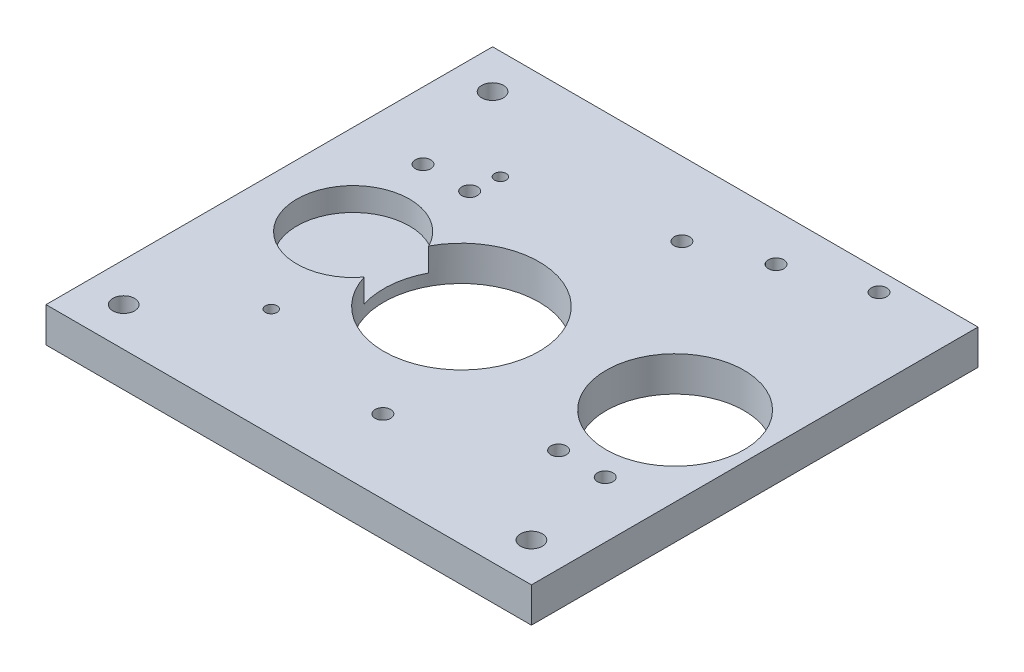
ISO-10303-21;
HEADER;
FILE_DESCRIPTION(('STEP AP214'),'2;1');
FILE_NAME('part.step','',(''),(''),'','','');
FILE_SCHEMA(('AUTOMOTIVE_DESIGN { 1 0 10303 214 1 1 1 1 }'));
ENDSEC;
DATA;
#1=APPLICATION_CONTEXT('core data for automotive mechanical design processes');
#2=APPLICATION_PROTOCOL_DEFINITION('international standard','automotive_design',2000,#1);
#3=PRODUCT_CONTEXT('',#1,'mechanical');
#4=PRODUCT('Part','Part','',(#3));
#5=PRODUCT_RELATED_PRODUCT_CATEGORY('part','',(#4));
#6=PRODUCT_DEFINITION_FORMATION('','',#4);
#7=PRODUCT_DEFINITION_CONTEXT('part definition',#1,'design');
#8=PRODUCT_DEFINITION('design','',#6,#7);
#9=PRODUCT_DEFINITION_SHAPE('','',#8);
#10=(LENGTH_UNIT() NAMED_UNIT(*) SI_UNIT(.MILLI.,.METRE.));
#11=(NAMED_UNIT(*) PLANE_ANGLE_UNIT() SI_UNIT($,.RADIAN.));
#12=(NAMED_UNIT(*) SI_UNIT($,.STERADIAN.) SOLID_ANGLE_UNIT());
#13=UNCERTAINTY_MEASURE_WITH_UNIT(LENGTH_MEASURE(1.E-05),#10,'distance_accuracy_value','');
#14=(GEOMETRIC_REPRESENTATION_CONTEXT(3) GLOBAL_UNCERTAINTY_ASSIGNED_CONTEXT((#13)) GLOBAL_UNIT_ASSIGNED_CONTEXT((#10,
#11,#12)) REPRESENTATION_CONTEXT('',''));
#15=CARTESIAN_POINT('',(0.,0.,0.));
#16=DIRECTION('',(0.,0.,1.));
#17=DIRECTION('',(1.,0.,0.));
#18=AXIS2_PLACEMENT_3D('',#15,#16,#17);
#19=CARTESIAN_POINT('',(17.25,0.,-79.8419145650698));
#20=DIRECTION('',(0.,1.,0.));
#21=DIRECTION('',(0.,0.,1.));
#22=AXIS2_PLACEMENT_3D('',#19,#20,#21);
#23=CYLINDRICAL_SURFACE('',#22,2.00000000000001);
#24=CARTESIAN_POINT('',(17.25,9.,-79.8419145650698));
#25=DIRECTION('',(0.,1.,0.));
#26=DIRECTION('',(0.,0.,1.));
#27=AXIS2_PLACEMENT_3D('',#24,#25,#26);
#28=CIRCLE('',#27,2.00000000000001);
#29=CARTESIAN_POINT('',(17.25,9.,-77.8419145650698));
#30=VERTEX_POINT('',#29);
#31=EDGE_CURVE('E189',#30,#30,#28,.T.);
#32=ORIENTED_EDGE('',*,*,#31,.T.);
#33=EDGE_LOOP('',(#32));
#34=FACE_BOUND('',#33,.T.);
#35=CARTESIAN_POINT('',(17.25,4.,-79.8419145650698));
#36=DIRECTION('',(0.,-1.,0.));
#37=DIRECTION('',(0.,0.,-1.));
#38=AXIS2_PLACEMENT_3D('',#35,#36,#37);
#39=CIRCLE('',#38,2.00000000000001);
#40=CARTESIAN_POINT('',(17.25,4.,-81.8419145650698));
#41=VERTEX_POINT('',#40);
#42=EDGE_CURVE('E40',#41,#41,#39,.F.);
#43=ORIENTED_EDGE('',*,*,#42,.F.);
#44=EDGE_LOOP('',(#43));
#45=FACE_BOUND('',#44,.T.);
#46=ADVANCED_FACE('F36',(#34,#45),#23,.F.);
#47=CARTESIAN_POINT('',(29.25,0.,-79.8419145650698));
#48=DIRECTION('',(0.,1.,0.));
#49=DIRECTION('',(0.,0.,1.));
#50=AXIS2_PLACEMENT_3D('',#47,#48,#49);
#51=CYLINDRICAL_SURFACE('',#50,2.);
#52=CARTESIAN_POINT('',(29.25,9.,-79.8419145650698));
#53=DIRECTION('',(0.,1.,0.));
#54=DIRECTION('',(0.,0.,-1.));
#55=AXIS2_PLACEMENT_3D('',#52,#53,#54);
#56=CIRCLE('',#55,2.);
#57=CARTESIAN_POINT('',(29.25,9.,-81.8419145650698));
#58=VERTEX_POINT('',#57);
#59=EDGE_CURVE('E164',#58,#58,#56,.T.);
#60=ORIENTED_EDGE('',*,*,#59,.T.);
#61=EDGE_LOOP('',(#60));
#62=FACE_BOUND('',#61,.T.);
#63=CARTESIAN_POINT('',(29.25,4.,-79.8419145650698));
#64=DIRECTION('',(0.,-1.,0.));
#65=DIRECTION('',(0.,0.,-1.));
#66=AXIS2_PLACEMENT_3D('',#63,#64,#65);
#67=CIRCLE('',#66,2.);
#68=CARTESIAN_POINT('',(29.25,4.,-81.8419145650698));
#69=VERTEX_POINT('',#68);
#70=EDGE_CURVE('E140',#69,#69,#67,.F.);
#71=ORIENTED_EDGE('',*,*,#70,.F.);
#72=EDGE_LOOP('',(#71));
#73=FACE_BOUND('',#72,.T.);
#74=ADVANCED_FACE('F253',(#62,#73),#51,.F.);
#75=CARTESIAN_POINT('',(0.,9.,0.));
#76=DIRECTION('',(1.,0.,0.));
#77=DIRECTION('',(0.,0.,-1.));
#78=AXIS2_PLACEMENT_3D('',#75,#76,#77);
#79=PLANE('',#78);
#80=DIRECTION('',(0.,0.,1.));
#81=VECTOR('',#80,1.);
#82=CARTESIAN_POINT('',(0.,0.,0.));
#83=LINE('',#82,#81);
#84=CARTESIAN_POINT('',(0.,0.,-115.));
#85=VERTEX_POINT('',#84);
#86=CARTESIAN_POINT('',(0.,0.,0.));
#87=VERTEX_POINT('',#86);
#88=EDGE_CURVE('E117',#85,#87,#83,.T.);
#89=ORIENTED_EDGE('',*,*,#88,.T.);
#90=DIRECTION('',(0.,-1.,0.));
#91=VECTOR('',#90,1.);
#92=CARTESIAN_POINT('',(0.,9.,0.));
#93=LINE('',#92,#91);
#94=CARTESIAN_POINT('',(0.,9.,0.));
#95=VERTEX_POINT('',#94);
#96=EDGE_CURVE('E45',#95,#87,#93,.T.);
#97=ORIENTED_EDGE('',*,*,#96,.F.);
#98=DIRECTION('',(0.,0.,1.));
#99=VECTOR('',#98,1.);
#100=CARTESIAN_POINT('',(0.,9.,0.));
#101=LINE('',#100,#99);
#102=CARTESIAN_POINT('',(0.,9.,-115.));
#103=VERTEX_POINT('',#102);
#104=EDGE_CURVE('E120',#103,#95,#101,.T.);
#105=ORIENTED_EDGE('',*,*,#104,.F.);
#106=DIRECTION('',(0.,-1.,0.));
#107=VECTOR('',#106,1.);
#108=CARTESIAN_POINT('',(0.,9.,-115.));
#109=LINE('',#108,#107);
#110=EDGE_CURVE('E126',#103,#85,#109,.T.);
#111=ORIENTED_EDGE('',*,*,#110,.T.);
#112=EDGE_LOOP('',(#89,#97,#105,#111));
#113=FACE_BOUND('',#112,.T.);
#114=ADVANCED_FACE('F38',(#113),#79,.F.);
#115=CARTESIAN_POINT('',(0.,9.,0.));
#116=DIRECTION('',(0.,0.,-1.));
#117=DIRECTION('',(-1.,0.,0.));
#118=AXIS2_PLACEMENT_3D('',#115,#116,#117);
#119=PLANE('',#118);
#120=DIRECTION('',(1.,0.,0.));
#121=VECTOR('',#120,1.);
#122=CARTESIAN_POINT('',(0.,0.,0.));
#123=LINE('',#122,#121);
#124=CARTESIAN_POINT('',(125.,0.,0.));
#125=VERTEX_POINT('',#124);
#126=EDGE_CURVE('E129',#87,#125,#123,.T.);
#127=ORIENTED_EDGE('',*,*,#126,.T.);
#128=DIRECTION('',(0.,-1.,0.));
#129=VECTOR('',#128,1.);
#130=CARTESIAN_POINT('',(125.,9.,0.));
#131=LINE('',#130,#129);
#132=CARTESIAN_POINT('',(125.,9.,0.));
#133=VERTEX_POINT('',#132);
#134=EDGE_CURVE('E137',#133,#125,#131,.T.);
#135=ORIENTED_EDGE('',*,*,#134,.F.);
#136=DIRECTION('',(1.,0.,0.));
#137=VECTOR('',#136,1.);
#138=CARTESIAN_POINT('',(0.,9.,0.));
#139=LINE('',#138,#137);
#140=EDGE_CURVE('E90',#95,#133,#139,.T.);
#141=ORIENTED_EDGE('',*,*,#140,.F.);
#142=ORIENTED_EDGE('',*,*,#96,.T.);
#143=EDGE_LOOP('',(#127,#135,#141,#142));
#144=FACE_BOUND('',#143,.T.);
#145=ADVANCED_FACE('F313',(#144),#119,.F.);
#146=CARTESIAN_POINT('',(125.,9.,0.));
#147=DIRECTION('',(-1.,0.,0.));
#148=DIRECTION('',(0.,0.,1.));
#149=AXIS2_PLACEMENT_3D('',#146,#147,#148);
#150=PLANE('',#149);
#151=DIRECTION('',(0.,0.,-1.));
#152=VECTOR('',#151,1.);
#153=CARTESIAN_POINT('',(125.,0.,0.));
#154=LINE('',#153,#152);
#155=CARTESIAN_POINT('',(125.,0.,-115.));
#156=VERTEX_POINT('',#155);
#157=EDGE_CURVE('E131',#125,#156,#154,.T.);
#158=ORIENTED_EDGE('',*,*,#157,.T.);
#159=DIRECTION('',(0.,-1.,0.));
#160=VECTOR('',#159,1.);
#161=CARTESIAN_POINT('',(125.,9.,-115.));
#162=LINE('',#161,#160);
#163=CARTESIAN_POINT('',(125.,9.,-115.));
#164=VERTEX_POINT('',#163);
#165=EDGE_CURVE('E135',#164,#156,#162,.T.);
#166=ORIENTED_EDGE('',*,*,#165,.F.);
#167=DIRECTION('',(0.,0.,-1.));
#168=VECTOR('',#167,1.);
#169=CARTESIAN_POINT('',(125.,9.,0.));
#170=LINE('',#169,#168);
#171=EDGE_CURVE('E123',#133,#164,#170,.T.);
#172=ORIENTED_EDGE('',*,*,#171,.F.);
#173=ORIENTED_EDGE('',*,*,#134,.T.);
#174=EDGE_LOOP('',(#158,#166,#172,#173));
#175=FACE_BOUND('',#174,.T.);
#176=ADVANCED_FACE('F307',(#175),#150,.F.);
#177=CARTESIAN_POINT('',(0.,9.,-115.));
#178=DIRECTION('',(0.,0.,1.));
#179=DIRECTION('',(1.,0.,0.));
#180=AXIS2_PLACEMENT_3D('',#177,#178,#179);
#181=PLANE('',#180);
#182=DIRECTION('',(-1.,0.,0.));
#183=VECTOR('',#182,1.);
#184=CARTESIAN_POINT('',(0.,0.,-115.));
#185=LINE('',#184,#183);
#186=EDGE_CURVE('E82',#156,#85,#185,.T.);
#187=ORIENTED_EDGE('',*,*,#186,.T.);
#188=ORIENTED_EDGE('',*,*,#110,.F.);
#189=DIRECTION('',(-1.,0.,0.));
#190=VECTOR('',#189,1.);
#191=CARTESIAN_POINT('',(0.,9.,-115.));
#192=LINE('',#191,#190);
#193=EDGE_CURVE('E61',#164,#103,#192,.T.);
#194=ORIENTED_EDGE('',*,*,#193,.F.);
#195=ORIENTED_EDGE('',*,*,#165,.T.);
#196=EDGE_LOOP('',(#187,#188,#194,#195));
#197=FACE_BOUND('',#196,.T.);
#198=ADVANCED_FACE('F298',(#197),#181,.F.);
#199=CARTESIAN_POINT('',(0.,9.,0.));
#200=DIRECTION('',(0.,-1.,0.));
#201=DIRECTION('',(0.,0.,-1.));
#202=AXIS2_PLACEMENT_3D('',#199,#200,#201);
#203=PLANE('',#202);
#204=CARTESIAN_POINT('',(9.99999999999999,9.,-105.));
#205=DIRECTION('',(0.,1.,0.));
#206=DIRECTION('',(0.,0.,1.));
#207=AXIS2_PLACEMENT_3D('',#204,#205,#206);
#208=CIRCLE('',#207,2.8);
#209=CARTESIAN_POINT('',(9.99999999999999,9.,-102.2));
#210=VERTEX_POINT('',#209);
#211=EDGE_CURVE('E165',#210,#210,#208,.T.);
#212=ORIENTED_EDGE('',*,*,#211,.F.);
#213=EDGE_LOOP('',(#212));
#214=FACE_BOUND('',#213,.T.);
#215=CARTESIAN_POINT('',(115.,9.,-10.));
#216=DIRECTION('',(0.,1.,0.));
#217=DIRECTION('',(0.,0.,1.));
#218=AXIS2_PLACEMENT_3D('',#215,#216,#217);
#219=CIRCLE('',#218,2.79999999999999);
#220=CARTESIAN_POINT('',(115.,9.,-7.20000000000001));
#221=VERTEX_POINT('',#220);
#222=EDGE_CURVE('E171',#221,#221,#219,.T.);
#223=ORIENTED_EDGE('',*,*,#222,.F.);
#224=EDGE_LOOP('',(#223));
#225=FACE_BOUND('',#224,.T.);
#226=CARTESIAN_POINT('',(10.,9.,-10.));
#227=DIRECTION('',(0.,1.,0.));
#228=DIRECTION('',(0.,0.,1.));
#229=AXIS2_PLACEMENT_3D('',#226,#227,#228);
#230=CIRCLE('',#229,2.8);
#231=CARTESIAN_POINT('',(10.,9.,-7.2));
#232=VERTEX_POINT('',#231);
#233=EDGE_CURVE('E146',#232,#232,#230,.T.);
#234=ORIENTED_EDGE('',*,*,#233,.F.);
#235=EDGE_LOOP('',(#234));
#236=FACE_BOUND('',#235,.T.);
#237=CARTESIAN_POINT('',(67.75,9.,-96.));
#238=DIRECTION('',(0.,1.,0.));
#239=DIRECTION('',(0.,0.,1.));
#240=AXIS2_PLACEMENT_3D('',#237,#238,#239);
#241=CIRCLE('',#240,2.);
#242=CARTESIAN_POINT('',(67.75,9.,-94.));
#243=VERTEX_POINT('',#242);
#244=EDGE_CURVE('E183',#243,#243,#241,.T.);
#245=ORIENTED_EDGE('',*,*,#244,.F.);
#246=EDGE_LOOP('',(#245));
#247=FACE_BOUND('',#246,.T.);
#248=ORIENTED_EDGE('',*,*,#59,.F.);
#249=EDGE_LOOP('',(#248));
#250=FACE_BOUND('',#249,.T.);
#251=ORIENTED_EDGE('',*,*,#31,.F.);
#252=EDGE_LOOP('',(#251));
#253=FACE_BOUND('',#252,.T.);
#254=CARTESIAN_POINT('',(67.75,9.,-19.));
#255=DIRECTION('',(0.,1.,0.));
#256=DIRECTION('',(0.,0.,-1.));
#257=AXIS2_PLACEMENT_3D('',#254,#255,#256);
#258=CIRCLE('',#257,2.);
#259=CARTESIAN_POINT('',(67.75,9.,-21.));
#260=VERTEX_POINT('',#259);
#261=EDGE_CURVE('E192',#260,#260,#258,.T.);
#262=ORIENTED_EDGE('',*,*,#261,.F.);
#263=EDGE_LOOP('',(#262));
#264=FACE_BOUND('',#263,.T.);
#265=CARTESIAN_POINT('',(104.5,9.,-110.));
#266=DIRECTION('',(0.,1.,0.));
#267=DIRECTION('',(0.,0.,1.));
#268=AXIS2_PLACEMENT_3D('',#265,#266,#267);
#269=CIRCLE('',#268,2.);
#270=CARTESIAN_POINT('',(104.5,9.,-108.));
#271=VERTEX_POINT('',#270);
#272=EDGE_CURVE('E201',#271,#271,#269,.T.);
#273=ORIENTED_EDGE('',*,*,#272,.F.);
#274=EDGE_LOOP('',(#273));
#275=FACE_BOUND('',#274,.T.);
#276=CARTESIAN_POINT('',(98.5,9.,-33.5));
#277=DIRECTION('',(0.,1.,0.));
#278=DIRECTION('',(0.,0.,-1.));
#279=AXIS2_PLACEMENT_3D('',#276,#277,#278);
#280=CIRCLE('',#279,2.);
#281=CARTESIAN_POINT('',(98.5,9.,-35.5));
#282=VERTEX_POINT('',#281);
#283=EDGE_CURVE('E182',#282,#282,#280,.T.);
#284=ORIENTED_EDGE('',*,*,#283,.F.);
#285=EDGE_LOOP('',(#284));
#286=FACE_BOUND('',#285,.T.);
#287=CARTESIAN_POINT('',(110.5,9.,-33.5));
#288=DIRECTION('',(0.,1.,0.));
#289=DIRECTION('',(0.,0.,1.));
#290=AXIS2_PLACEMENT_3D('',#287,#288,#289);
#291=CIRCLE('',#290,2.);
#292=CARTESIAN_POINT('',(110.5,9.,-31.5));
#293=VERTEX_POINT('',#292);
#294=EDGE_CURVE('E208',#293,#293,#291,.T.);
#295=ORIENTED_EDGE('',*,*,#294,.F.);
#296=EDGE_LOOP('',(#295));
#297=FACE_BOUND('',#296,.T.);
#298=CARTESIAN_POINT('',(85.,9.,-103.));
#299=DIRECTION('',(0.,1.,0.));
#300=DIRECTION('',(0.,0.,1.));
#301=AXIS2_PLACEMENT_3D('',#298,#299,#300);
#302=CIRCLE('',#301,2.);
#303=CARTESIAN_POINT('',(85.,9.,-101.));
#304=VERTEX_POINT('',#303);
#305=EDGE_CURVE('E213',#304,#304,#302,.T.);
#306=ORIENTED_EDGE('',*,*,#305,.F.);
#307=EDGE_LOOP('',(#306));
#308=FACE_BOUND('',#307,.T.);
#309=CARTESIAN_POINT('',(30.,9.,-28.));
#310=DIRECTION('',(0.,-1.,0.));
#311=DIRECTION('',(0.,0.,-1.));
#312=AXIS2_PLACEMENT_3D('',#309,#310,#311);
#313=CIRCLE('',#312,1.5);
#314=CARTESIAN_POINT('',(30.,9.,-29.5));
#315=VERTEX_POINT('',#314);
#316=EDGE_CURVE('E221',#315,#315,#313,.T.);
#317=ORIENTED_EDGE('',*,*,#316,.T.);
#318=EDGE_LOOP('',(#317));
#319=FACE_BOUND('',#318,.T.);
#320=CARTESIAN_POINT('',(30.,9.,-87.));
#321=DIRECTION('',(0.,-1.,0.));
#322=DIRECTION('',(0.,0.,1.));
#323=AXIS2_PLACEMENT_3D('',#320,#321,#322);
#324=CIRCLE('',#323,1.5);
#325=CARTESIAN_POINT('',(30.,9.,-85.5));
#326=VERTEX_POINT('',#325);
#327=EDGE_CURVE('E228',#326,#326,#324,.T.);
#328=ORIENTED_EDGE('',*,*,#327,.T.);
#329=EDGE_LOOP('',(#328));
#330=FACE_BOUND('',#329,.T.);
#331=CARTESIAN_POINT('',(104.5,9.,-57.5));
#332=DIRECTION('',(0.,1.,0.));
#333=DIRECTION('',(0.,0.,1.));
#334=AXIS2_PLACEMENT_3D('',#331,#332,#333);
#335=CIRCLE('',#334,17.75);
#336=CARTESIAN_POINT('',(104.5,9.,-39.75));
#337=VERTEX_POINT('',#336);
#338=EDGE_CURVE('E224',#337,#337,#335,.T.);
#339=ORIENTED_EDGE('',*,*,#338,.F.);
#340=EDGE_LOOP('',(#339));
#341=FACE_BOUND('',#340,.T.);
#342=CARTESIAN_POINT('',(23.25,9.,-55.8419145650698));
#343=DIRECTION('',(0.,1.,0.));
#344=DIRECTION('',(0.,0.,1.));
#345=AXIS2_PLACEMENT_3D('',#342,#343,#344);
#346=CIRCLE('',#345,14.5);
#347=CARTESIAN_POINT('',(36.2122369434823,9.,-62.3404077304908));
#348=VERTEX_POINT('',#347);
#349=CARTESIAN_POINT('',(34.8255639944598,9.,-47.1094281946157));
#350=VERTEX_POINT('',#349);
#351=EDGE_CURVE('E111',#348,#350,#346,.T.);
#352=ORIENTED_EDGE('',*,*,#351,.F.);
#353=CARTESIAN_POINT('',(53.9231403520528,9.,-53.0493421052631));
#354=DIRECTION('',(0.,1.,0.));
#355=DIRECTION('',(0.,0.,1.));
#356=AXIS2_PLACEMENT_3D('',#353,#354,#355);
#357=CIRCLE('',#356,20.);
#358=EDGE_CURVE('E98',#350,#348,#357,.T.);
#359=ORIENTED_EDGE('',*,*,#358,.F.);
#360=EDGE_LOOP('',(#352,#359));
#361=FACE_BOUND('',#360,.T.);
#362=ORIENTED_EDGE('',*,*,#104,.T.);
#363=ORIENTED_EDGE('',*,*,#140,.T.);
#364=ORIENTED_EDGE('',*,*,#171,.T.);
#365=ORIENTED_EDGE('',*,*,#193,.T.);
#366=EDGE_LOOP('',(#362,#363,#364,#365));
#367=FACE_BOUND('',#366,.T.);
#368=ADVANCED_FACE('F115',(#214,#225,#236,#247,#250,#253,#264,#275,#286,#297,#308,#319,#330,
#341,#361,#367),#203,.F.);
#369=CARTESIAN_POINT('',(0.,0.,0.));
#370=DIRECTION('',(0.,-1.,0.));
#371=DIRECTION('',(0.,0.,-1.));
#372=AXIS2_PLACEMENT_3D('',#369,#370,#371);
#373=PLANE('',#372);
#374=CARTESIAN_POINT('',(29.25,0.,-79.8419145650698));
#375=DIRECTION('',(0.,-1.,0.));
#376=DIRECTION('',(0.,0.,-1.));
#377=AXIS2_PLACEMENT_3D('',#374,#375,#376);
#378=CIRCLE('',#377,3.75000000000001);
#379=CARTESIAN_POINT('',(29.25,0.,-83.5919145650698));
#380=VERTEX_POINT('',#379);
#381=EDGE_CURVE('E148',#380,#380,#378,.T.);
#382=ORIENTED_EDGE('',*,*,#381,.F.);
#383=EDGE_LOOP('',(#382));
#384=FACE_BOUND('',#383,.T.);
#385=CARTESIAN_POINT('',(17.25,0.,-79.8419145650698));
#386=DIRECTION('',(0.,-1.,0.));
#387=DIRECTION('',(0.,0.,-1.));
#388=AXIS2_PLACEMENT_3D('',#385,#386,#387);
#389=CIRCLE('',#388,3.75);
#390=CARTESIAN_POINT('',(17.25,0.,-83.5919145650698));
#391=VERTEX_POINT('',#390);
#392=EDGE_CURVE('E158',#391,#391,#389,.T.);
#393=ORIENTED_EDGE('',*,*,#392,.F.);
#394=EDGE_LOOP('',(#393));
#395=FACE_BOUND('',#394,.T.);
#396=CARTESIAN_POINT('',(9.99999999999999,0.,-105.));
#397=DIRECTION('',(0.,1.,0.));
#398=DIRECTION('',(0.,0.,1.));
#399=AXIS2_PLACEMENT_3D('',#396,#397,#398);
#400=CIRCLE('',#399,2.8);
#401=CARTESIAN_POINT('',(9.99999999999999,0.,-102.2));
#402=VERTEX_POINT('',#401);
#403=EDGE_CURVE('E161',#402,#402,#400,.T.);
#404=ORIENTED_EDGE('',*,*,#403,.T.);
#405=EDGE_LOOP('',(#404));
#406=FACE_BOUND('',#405,.T.);
#407=CARTESIAN_POINT('',(115.,0.,-10.));
#408=DIRECTION('',(0.,1.,0.));
#409=DIRECTION('',(0.,0.,1.));
#410=AXIS2_PLACEMENT_3D('',#407,#408,#409);
#411=CIRCLE('',#410,2.79999999999999);
#412=CARTESIAN_POINT('',(115.,0.,-7.20000000000001));
#413=VERTEX_POINT('',#412);
#414=EDGE_CURVE('E168',#413,#413,#411,.T.);
#415=ORIENTED_EDGE('',*,*,#414,.T.);
#416=EDGE_LOOP('',(#415));
#417=FACE_BOUND('',#416,.T.);
#418=CARTESIAN_POINT('',(10.,0.,-10.));
#419=DIRECTION('',(0.,1.,0.));
#420=DIRECTION('',(0.,0.,1.));
#421=AXIS2_PLACEMENT_3D('',#418,#419,#420);
#422=CIRCLE('',#421,2.8);
#423=CARTESIAN_POINT('',(10.,0.,-7.2));
#424=VERTEX_POINT('',#423);
#425=EDGE_CURVE('E174',#424,#424,#422,.T.);
#426=ORIENTED_EDGE('',*,*,#425,.T.);
#427=EDGE_LOOP('',(#426));
#428=FACE_BOUND('',#427,.T.);
#429=CARTESIAN_POINT('',(67.75,0.,-96.));
#430=DIRECTION('',(0.,1.,0.));
#431=DIRECTION('',(0.,0.,1.));
#432=AXIS2_PLACEMENT_3D('',#429,#430,#431);
#433=CIRCLE('',#432,2.);
#434=CARTESIAN_POINT('',(67.75,0.,-94.));
#435=VERTEX_POINT('',#434);
#436=EDGE_CURVE('E179',#435,#435,#433,.T.);
#437=ORIENTED_EDGE('',*,*,#436,.T.);
#438=EDGE_LOOP('',(#437));
#439=FACE_BOUND('',#438,.T.);
#440=CARTESIAN_POINT('',(67.75,0.,-19.));
#441=DIRECTION('',(0.,1.,0.));
#442=DIRECTION('',(0.,0.,-1.));
#443=AXIS2_PLACEMENT_3D('',#440,#441,#442);
#444=CIRCLE('',#443,2.);
#445=CARTESIAN_POINT('',(67.75,0.,-21.));
#446=VERTEX_POINT('',#445);
#447=EDGE_CURVE('E186',#446,#446,#444,.T.);
#448=ORIENTED_EDGE('',*,*,#447,.T.);
#449=EDGE_LOOP('',(#448));
#450=FACE_BOUND('',#449,.T.);
#451=CARTESIAN_POINT('',(104.5,0.,-110.));
#452=DIRECTION('',(0.,1.,0.));
#453=DIRECTION('',(0.,0.,1.));
#454=AXIS2_PLACEMENT_3D('',#451,#452,#453);
#455=CIRCLE('',#454,2.);
#456=CARTESIAN_POINT('',(104.5,0.,-108.));
#457=VERTEX_POINT('',#456);
#458=EDGE_CURVE('E197',#457,#457,#455,.T.);
#459=ORIENTED_EDGE('',*,*,#458,.T.);
#460=EDGE_LOOP('',(#459));
#461=FACE_BOUND('',#460,.T.);
#462=CARTESIAN_POINT('',(98.5,0.,-33.5));
#463=DIRECTION('',(0.,1.,0.));
#464=DIRECTION('',(0.,0.,-1.));
#465=AXIS2_PLACEMENT_3D('',#462,#463,#464);
#466=CIRCLE('',#465,2.);
#467=CARTESIAN_POINT('',(98.5,0.,-35.5));
#468=VERTEX_POINT('',#467);
#469=EDGE_CURVE('E205',#468,#468,#466,.T.);
#470=ORIENTED_EDGE('',*,*,#469,.T.);
#471=EDGE_LOOP('',(#470));
#472=FACE_BOUND('',#471,.T.);
#473=CARTESIAN_POINT('',(110.5,0.,-33.5));
#474=DIRECTION('',(0.,1.,0.));
#475=DIRECTION('',(0.,0.,1.));
#476=AXIS2_PLACEMENT_3D('',#473,#474,#475);
#477=CIRCLE('',#476,2.);
#478=CARTESIAN_POINT('',(110.5,0.,-31.5));
#479=VERTEX_POINT('',#478);
#480=EDGE_CURVE('E216',#479,#479,#477,.T.);
#481=ORIENTED_EDGE('',*,*,#480,.T.);
#482=EDGE_LOOP('',(#481));
#483=FACE_BOUND('',#482,.T.);
#484=CARTESIAN_POINT('',(85.,0.,-103.));
#485=DIRECTION('',(0.,1.,0.));
#486=DIRECTION('',(0.,0.,1.));
#487=AXIS2_PLACEMENT_3D('',#484,#485,#486);
#488=CIRCLE('',#487,2.);
#489=CARTESIAN_POINT('',(85.,0.,-101.));
#490=VERTEX_POINT('',#489);
#491=EDGE_CURVE('E204',#490,#490,#488,.T.);
#492=ORIENTED_EDGE('',*,*,#491,.T.);
#493=EDGE_LOOP('',(#492));
#494=FACE_BOUND('',#493,.T.);
#495=CARTESIAN_POINT('',(30.,0.,-28.));
#496=DIRECTION('',(0.,-1.,0.));
#497=DIRECTION('',(0.,0.,-1.));
#498=AXIS2_PLACEMENT_3D('',#495,#496,#497);
#499=CIRCLE('',#498,1.5);
#500=CARTESIAN_POINT('',(30.,0.,-29.5));
#501=VERTEX_POINT('',#500);
#502=EDGE_CURVE('E225',#501,#501,#499,.T.);
#503=ORIENTED_EDGE('',*,*,#502,.F.);
#504=EDGE_LOOP('',(#503));
#505=FACE_BOUND('',#504,.T.);
#506=CARTESIAN_POINT('',(30.,0.,-87.));
#507=DIRECTION('',(0.,-1.,0.));
#508=DIRECTION('',(0.,0.,1.));
#509=AXIS2_PLACEMENT_3D('',#506,#507,#508);
#510=CIRCLE('',#509,1.5);
#511=CARTESIAN_POINT('',(30.,0.,-85.5));
#512=VERTEX_POINT('',#511);
#513=EDGE_CURVE('E200',#512,#512,#510,.T.);
#514=ORIENTED_EDGE('',*,*,#513,.F.);
#515=EDGE_LOOP('',(#514));
#516=FACE_BOUND('',#515,.T.);
#517=CARTESIAN_POINT('',(104.5,0.,-57.5));
#518=DIRECTION('',(0.,1.,0.));
#519=DIRECTION('',(0.,0.,1.));
#520=AXIS2_PLACEMENT_3D('',#517,#518,#519);
#521=CIRCLE('',#520,17.75);
#522=CARTESIAN_POINT('',(104.5,0.,-39.75));
#523=VERTEX_POINT('',#522);
#524=EDGE_CURVE('E106',#523,#523,#521,.T.);
#525=ORIENTED_EDGE('',*,*,#524,.T.);
#526=EDGE_LOOP('',(#525));
#527=FACE_BOUND('',#526,.T.);
#528=CARTESIAN_POINT('',(53.9231403520528,0.,-53.0493421052631));
#529=DIRECTION('',(0.,1.,0.));
#530=DIRECTION('',(0.,0.,1.));
#531=AXIS2_PLACEMENT_3D('',#528,#529,#530);
#532=CIRCLE('',#531,20.);
#533=CARTESIAN_POINT('',(53.9231403520528,0.,-33.0493421052632));
#534=VERTEX_POINT('',#533);
#535=EDGE_CURVE('E105',#534,#534,#532,.T.);
#536=ORIENTED_EDGE('',*,*,#535,.T.);
#537=EDGE_LOOP('',(#536));
#538=FACE_BOUND('',#537,.T.);
#539=ORIENTED_EDGE('',*,*,#88,.F.);
#540=ORIENTED_EDGE('',*,*,#186,.F.);
#541=ORIENTED_EDGE('',*,*,#157,.F.);
#542=ORIENTED_EDGE('',*,*,#126,.F.);
#543=EDGE_LOOP('',(#539,#540,#541,#542));
#544=FACE_BOUND('',#543,.T.);
#545=ADVANCED_FACE('F250',(#384,#395,#406,#417,#428,#439,#450,#461,#472,#483,#494,#505,#516,
#527,#538,#544),#373,.T.);
#546=CARTESIAN_POINT('',(23.25,3.,-55.8419145650698));
#547=DIRECTION('',(0.,1.,0.));
#548=DIRECTION('',(0.,0.,1.));
#549=AXIS2_PLACEMENT_3D('',#546,#547,#548);
#550=CYLINDRICAL_SURFACE('',#549,14.5);
#551=CARTESIAN_POINT('',(23.25,3.,-55.8419145650698));
#552=DIRECTION('',(0.,1.,0.));
#553=DIRECTION('',(0.,0.,1.));
#554=AXIS2_PLACEMENT_3D('',#551,#552,#553);
#555=CIRCLE('',#554,14.5);
#556=CARTESIAN_POINT('',(36.2122369434823,3.,-62.3404077304908));
#557=VERTEX_POINT('',#556);
#558=CARTESIAN_POINT('',(34.8255639944598,3.,-47.1094281946157));
#559=VERTEX_POINT('',#558);
#560=EDGE_CURVE('E113',#557,#559,#555,.T.);
#561=ORIENTED_EDGE('',*,*,#560,.F.);
#562=DIRECTION('',(0.,1.,0.));
#563=VECTOR('',#562,1.);
#564=CARTESIAN_POINT('',(36.2122369434823,4.5,-62.3404077304908));
#565=LINE('',#564,#563);
#566=EDGE_CURVE('E52',#557,#348,#565,.T.);
#567=ORIENTED_EDGE('',*,*,#566,.T.);
#568=ORIENTED_EDGE('',*,*,#351,.T.);
#569=DIRECTION('',(0.,1.,0.));
#570=VECTOR('',#569,1.);
#571=CARTESIAN_POINT('',(34.8255639944598,4.5,-47.1094281946157));
#572=LINE('',#571,#570);
#573=EDGE_CURVE('E101',#350,#559,#572,.F.);
#574=ORIENTED_EDGE('',*,*,#573,.T.);
#575=EDGE_LOOP('',(#561,#567,#568,#574));
#576=FACE_BOUND('',#575,.T.);
#577=ADVANCED_FACE('F110',(#576),#550,.F.);
#578=CARTESIAN_POINT('',(23.25,3.,-55.8419145650698));
#579=DIRECTION('',(0.,1.,0.));
#580=DIRECTION('',(0.,0.,1.));
#581=AXIS2_PLACEMENT_3D('',#578,#579,#580);
#582=PLANE('',#581);
#583=CARTESIAN_POINT('',(53.9231403520528,3.,-53.0493421052631));
#584=DIRECTION('',(0.,1.,0.));
#585=DIRECTION('',(0.,0.,1.));
#586=AXIS2_PLACEMENT_3D('',#583,#584,#585);
#587=CIRCLE('',#586,20.);
#588=EDGE_CURVE('E11',#557,#559,#587,.T.);
#589=ORIENTED_EDGE('',*,*,#588,.F.);
#590=ORIENTED_EDGE('',*,*,#560,.T.);
#591=EDGE_LOOP('',(#589,#590));
#592=FACE_BOUND('',#591,.T.);
#593=ADVANCED_FACE('F240',(#592),#582,.T.);
#594=CARTESIAN_POINT('',(53.9231403520528,0.,-53.0493421052631));
#595=DIRECTION('',(0.,1.,0.));
#596=DIRECTION('',(0.,0.,1.));
#597=AXIS2_PLACEMENT_3D('',#594,#595,#596);
#598=CYLINDRICAL_SURFACE('',#597,20.);
#599=ORIENTED_EDGE('',*,*,#535,.F.);
#600=EDGE_LOOP('',(#599));
#601=FACE_BOUND('',#600,.T.);
#602=ORIENTED_EDGE('',*,*,#588,.T.);
#603=ORIENTED_EDGE('',*,*,#573,.F.);
#604=ORIENTED_EDGE('',*,*,#358,.T.);
#605=ORIENTED_EDGE('',*,*,#566,.F.);
#606=EDGE_LOOP('',(#602,#603,#604,#605));
#607=FACE_BOUND('',#606,.T.);
#608=ADVANCED_FACE('F99',(#601,#607),#598,.F.);
#609=CARTESIAN_POINT('',(104.5,0.,-57.5));
#610=DIRECTION('',(0.,1.,0.));
#611=DIRECTION('',(0.,0.,1.));
#612=AXIS2_PLACEMENT_3D('',#609,#610,#611);
#613=CYLINDRICAL_SURFACE('',#612,17.75);
#614=ORIENTED_EDGE('',*,*,#524,.F.);
#615=EDGE_LOOP('',(#614));
#616=FACE_BOUND('',#615,.T.);
#617=ORIENTED_EDGE('',*,*,#338,.T.);
#618=EDGE_LOOP('',(#617));
#619=FACE_BOUND('',#618,.T.);
#620=ADVANCED_FACE('F247',(#616,#619),#613,.F.);
#621=CARTESIAN_POINT('',(30.,9.,-87.));
#622=DIRECTION('',(0.,-1.,0.));
#623=DIRECTION('',(0.,0.,-1.));
#624=AXIS2_PLACEMENT_3D('',#621,#622,#623);
#625=CYLINDRICAL_SURFACE('',#624,1.5);
#626=ORIENTED_EDGE('',*,*,#327,.F.);
#627=EDGE_LOOP('',(#626));
#628=FACE_BOUND('',#627,.T.);
#629=ORIENTED_EDGE('',*,*,#513,.T.);
#630=EDGE_LOOP('',(#629));
#631=FACE_BOUND('',#630,.T.);
#632=ADVANCED_FACE('F284',(#628,#631),#625,.F.);
#633=CARTESIAN_POINT('',(30.,9.,-28.));
#634=DIRECTION('',(0.,-1.,0.));
#635=DIRECTION('',(0.,0.,-1.));
#636=AXIS2_PLACEMENT_3D('',#633,#634,#635);
#637=CYLINDRICAL_SURFACE('',#636,1.5);
#638=ORIENTED_EDGE('',*,*,#316,.F.);
#639=EDGE_LOOP('',(#638));
#640=FACE_BOUND('',#639,.T.);
#641=ORIENTED_EDGE('',*,*,#502,.T.);
#642=EDGE_LOOP('',(#641));
#643=FACE_BOUND('',#642,.T.);
#644=ADVANCED_FACE('F277',(#640,#643),#637,.F.);
#645=CARTESIAN_POINT('',(85.,0.,-103.));
#646=DIRECTION('',(0.,1.,0.));
#647=DIRECTION('',(0.,0.,1.));
#648=AXIS2_PLACEMENT_3D('',#645,#646,#647);
#649=CYLINDRICAL_SURFACE('',#648,2.);
#650=ORIENTED_EDGE('',*,*,#491,.F.);
#651=EDGE_LOOP('',(#650));
#652=FACE_BOUND('',#651,.T.);
#653=ORIENTED_EDGE('',*,*,#305,.T.);
#654=EDGE_LOOP('',(#653));
#655=FACE_BOUND('',#654,.T.);
#656=ADVANCED_FACE('F274',(#652,#655),#649,.F.);
#657=CARTESIAN_POINT('',(110.5,0.,-33.5));
#658=DIRECTION('',(0.,1.,0.));
#659=DIRECTION('',(0.,0.,1.));
#660=AXIS2_PLACEMENT_3D('',#657,#658,#659);
#661=CYLINDRICAL_SURFACE('',#660,2.);
#662=ORIENTED_EDGE('',*,*,#480,.F.);
#663=EDGE_LOOP('',(#662));
#664=FACE_BOUND('',#663,.T.);
#665=ORIENTED_EDGE('',*,*,#294,.T.);
#666=EDGE_LOOP('',(#665));
#667=FACE_BOUND('',#666,.T.);
#668=ADVANCED_FACE('F272',(#664,#667),#661,.F.);
#669=CARTESIAN_POINT('',(98.5,0.,-33.5));
#670=DIRECTION('',(0.,1.,0.));
#671=DIRECTION('',(0.,0.,1.));
#672=AXIS2_PLACEMENT_3D('',#669,#670,#671);
#673=CYLINDRICAL_SURFACE('',#672,2.);
#674=ORIENTED_EDGE('',*,*,#469,.F.);
#675=EDGE_LOOP('',(#674));
#676=FACE_BOUND('',#675,.T.);
#677=ORIENTED_EDGE('',*,*,#283,.T.);
#678=EDGE_LOOP('',(#677));
#679=FACE_BOUND('',#678,.T.);
#680=ADVANCED_FACE('F268',(#676,#679),#673,.F.);
#681=CARTESIAN_POINT('',(104.5,0.,-110.));
#682=DIRECTION('',(0.,1.,0.));
#683=DIRECTION('',(0.,0.,1.));
#684=AXIS2_PLACEMENT_3D('',#681,#682,#683);
#685=CYLINDRICAL_SURFACE('',#684,2.);
#686=ORIENTED_EDGE('',*,*,#458,.F.);
#687=EDGE_LOOP('',(#686));
#688=FACE_BOUND('',#687,.T.);
#689=ORIENTED_EDGE('',*,*,#272,.T.);
#690=EDGE_LOOP('',(#689));
#691=FACE_BOUND('',#690,.T.);
#692=ADVANCED_FACE('F265',(#688,#691),#685,.F.);
#693=CARTESIAN_POINT('',(67.75,0.,-19.));
#694=DIRECTION('',(0.,1.,0.));
#695=DIRECTION('',(0.,0.,1.));
#696=AXIS2_PLACEMENT_3D('',#693,#694,#695);
#697=CYLINDRICAL_SURFACE('',#696,2.);
#698=ORIENTED_EDGE('',*,*,#447,.F.);
#699=EDGE_LOOP('',(#698));
#700=FACE_BOUND('',#699,.T.);
#701=ORIENTED_EDGE('',*,*,#261,.T.);
#702=EDGE_LOOP('',(#701));
#703=FACE_BOUND('',#702,.T.);
#704=ADVANCED_FACE('F264',(#700,#703),#697,.F.);
#705=CARTESIAN_POINT('',(67.75,0.,-96.));
#706=DIRECTION('',(0.,1.,0.));
#707=DIRECTION('',(0.,0.,1.));
#708=AXIS2_PLACEMENT_3D('',#705,#706,#707);
#709=CYLINDRICAL_SURFACE('',#708,2.);
#710=ORIENTED_EDGE('',*,*,#436,.F.);
#711=EDGE_LOOP('',(#710));
#712=FACE_BOUND('',#711,.T.);
#713=ORIENTED_EDGE('',*,*,#244,.T.);
#714=EDGE_LOOP('',(#713));
#715=FACE_BOUND('',#714,.T.);
#716=ADVANCED_FACE('F402',(#712,#715),#709,.F.);
#717=CARTESIAN_POINT('',(10.,0.,-10.));
#718=DIRECTION('',(0.,1.,0.));
#719=DIRECTION('',(0.,0.,1.));
#720=AXIS2_PLACEMENT_3D('',#717,#718,#719);
#721=CYLINDRICAL_SURFACE('',#720,2.8);
#722=ORIENTED_EDGE('',*,*,#425,.F.);
#723=EDGE_LOOP('',(#722));
#724=FACE_BOUND('',#723,.T.);
#725=ORIENTED_EDGE('',*,*,#233,.T.);
#726=EDGE_LOOP('',(#725));
#727=FACE_BOUND('',#726,.T.);
#728=ADVANCED_FACE('F398',(#724,#727),#721,.F.);
#729=CARTESIAN_POINT('',(115.,0.,-10.));
#730=DIRECTION('',(0.,1.,0.));
#731=DIRECTION('',(0.,0.,1.));
#732=AXIS2_PLACEMENT_3D('',#729,#730,#731);
#733=CYLINDRICAL_SURFACE('',#732,2.79999999999999);
#734=ORIENTED_EDGE('',*,*,#414,.F.);
#735=EDGE_LOOP('',(#734));
#736=FACE_BOUND('',#735,.T.);
#737=ORIENTED_EDGE('',*,*,#222,.T.);
#738=EDGE_LOOP('',(#737));
#739=FACE_BOUND('',#738,.T.);
#740=ADVANCED_FACE('F394',(#736,#739),#733,.F.);
#741=CARTESIAN_POINT('',(9.99999999999999,0.,-105.));
#742=DIRECTION('',(0.,1.,0.));
#743=DIRECTION('',(0.,0.,1.));
#744=AXIS2_PLACEMENT_3D('',#741,#742,#743);
#745=CYLINDRICAL_SURFACE('',#744,2.8);
#746=ORIENTED_EDGE('',*,*,#403,.F.);
#747=EDGE_LOOP('',(#746));
#748=FACE_BOUND('',#747,.T.);
#749=ORIENTED_EDGE('',*,*,#211,.T.);
#750=EDGE_LOOP('',(#749));
#751=FACE_BOUND('',#750,.T.);
#752=ADVANCED_FACE('F356',(#748,#751),#745,.F.);
#753=CARTESIAN_POINT('',(29.25,4.,-79.8419145650698));
#754=DIRECTION('',(0.,-1.,0.));
#755=DIRECTION('',(0.,0.,-1.));
#756=AXIS2_PLACEMENT_3D('',#753,#754,#755);
#757=PLANE('',#756);
#758=CARTESIAN_POINT('',(29.25,4.,-79.8419145650698));
#759=DIRECTION('',(0.,-1.,0.));
#760=DIRECTION('',(0.,0.,-1.));
#761=AXIS2_PLACEMENT_3D('',#758,#759,#760);
#762=CIRCLE('',#761,3.75000000000001);
#763=CARTESIAN_POINT('',(29.25,4.,-83.5919145650698));
#764=VERTEX_POINT('',#763);
#765=EDGE_CURVE('E142',#764,#764,#762,.T.);
#766=ORIENTED_EDGE('',*,*,#765,.T.);
#767=EDGE_LOOP('',(#766));
#768=FACE_BOUND('',#767,.T.);
#769=ORIENTED_EDGE('',*,*,#70,.T.);
#770=EDGE_LOOP('',(#769));
#771=FACE_BOUND('',#770,.T.);
#772=ADVANCED_FACE('F350',(#768,#771),#757,.T.);
#773=CARTESIAN_POINT('',(29.25,4.,-79.8419145650698));
#774=DIRECTION('',(0.,-1.,0.));
#775=DIRECTION('',(0.,0.,-1.));
#776=AXIS2_PLACEMENT_3D('',#773,#774,#775);
#777=CYLINDRICAL_SURFACE('',#776,3.75000000000001);
#778=ORIENTED_EDGE('',*,*,#765,.F.);
#779=EDGE_LOOP('',(#778));
#780=FACE_BOUND('',#779,.T.);
#781=ORIENTED_EDGE('',*,*,#381,.T.);
#782=EDGE_LOOP('',(#781));
#783=FACE_BOUND('',#782,.T.);
#784=ADVANCED_FACE('F355',(#780,#783),#777,.F.);
#785=CARTESIAN_POINT('',(17.25,4.,-79.8419145650698));
#786=DIRECTION('',(0.,-1.,0.));
#787=DIRECTION('',(0.,0.,-1.));
#788=AXIS2_PLACEMENT_3D('',#785,#786,#787);
#789=PLANE('',#788);
#790=CARTESIAN_POINT('',(17.25,4.,-79.8419145650698));
#791=DIRECTION('',(0.,-1.,0.));
#792=DIRECTION('',(0.,0.,-1.));
#793=AXIS2_PLACEMENT_3D('',#790,#791,#792);
#794=CIRCLE('',#793,3.75);
#795=CARTESIAN_POINT('',(17.25,4.,-83.5919145650698));
#796=VERTEX_POINT('',#795);
#797=EDGE_CURVE('E153',#796,#796,#794,.T.);
#798=ORIENTED_EDGE('',*,*,#797,.T.);
#799=EDGE_LOOP('',(#798));
#800=FACE_BOUND('',#799,.T.);
#801=ORIENTED_EDGE('',*,*,#42,.T.);
#802=EDGE_LOOP('',(#801));
#803=FACE_BOUND('',#802,.T.);
#804=ADVANCED_FACE('F366',(#800,#803),#789,.T.);
#805=CARTESIAN_POINT('',(17.25,4.,-79.8419145650698));
#806=DIRECTION('',(0.,-1.,0.));
#807=DIRECTION('',(0.,0.,-1.));
#808=AXIS2_PLACEMENT_3D('',#805,#806,#807);
#809=CYLINDRICAL_SURFACE('',#808,3.75);
#810=ORIENTED_EDGE('',*,*,#797,.F.);
#811=EDGE_LOOP('',(#810));
#812=FACE_BOUND('',#811,.T.);
#813=ORIENTED_EDGE('',*,*,#392,.T.);
#814=EDGE_LOOP('',(#813));
#815=FACE_BOUND('',#814,.T.);
#816=ADVANCED_FACE('F376',(#812,#815),#809,.F.);
#817=CLOSED_SHELL('',(#46,#74,#114,#145,#176,#198,#368,#545,#577,#593,#608,#620,#632,#644,#656,
#668,#680,#692,#704,#716,#728,#740,#752,#772,#784,#804,#816));
#818=MANIFOLD_SOLID_BREP('B2',#817);
#819=ADVANCED_BREP_SHAPE_REPRESENTATION('',(#18,#818),#14);
#820=SHAPE_DEFINITION_REPRESENTATION(#9,#819);
ENDSEC;
END-ISO-10303-21;
